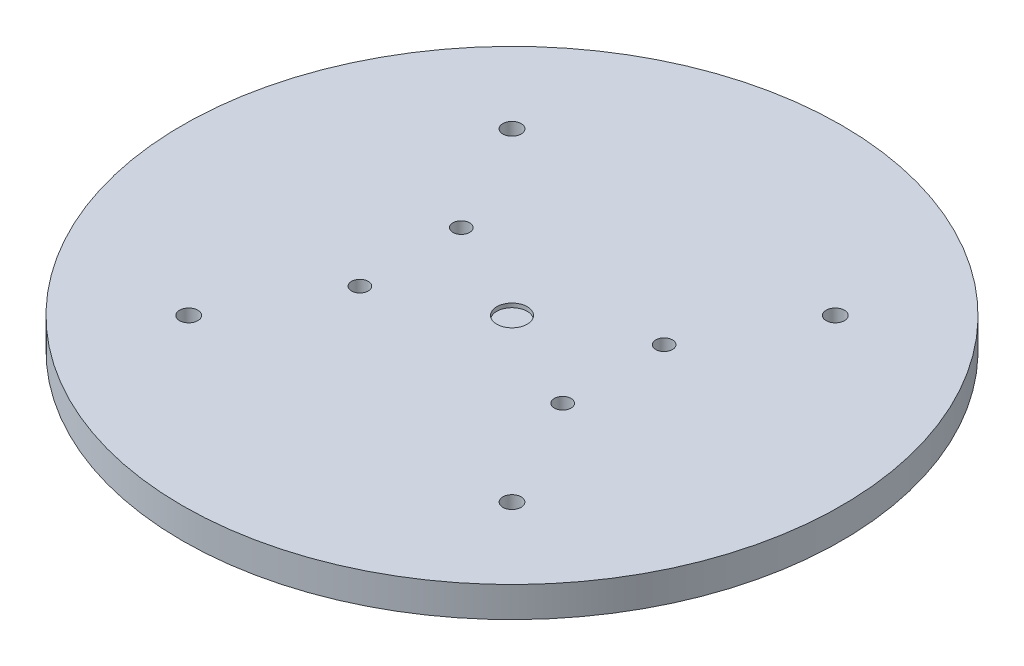
ISO-10303-21;
HEADER;
FILE_DESCRIPTION(('STEP AP214'),'2;1');
FILE_NAME('part.step','',(''),(''),'','','');
FILE_SCHEMA(('AUTOMOTIVE_DESIGN { 1 0 10303 214 1 1 1 1 }'));
ENDSEC;
DATA;
#1=APPLICATION_CONTEXT('core data for automotive mechanical design processes');
#2=APPLICATION_PROTOCOL_DEFINITION('international standard','automotive_design',2000,#1);
#3=PRODUCT_CONTEXT('',#1,'mechanical');
#4=PRODUCT('Part','Part','',(#3));
#5=PRODUCT_RELATED_PRODUCT_CATEGORY('part','',(#4));
#6=PRODUCT_DEFINITION_FORMATION('','',#4);
#7=PRODUCT_DEFINITION_CONTEXT('part definition',#1,'design');
#8=PRODUCT_DEFINITION('design','',#6,#7);
#9=PRODUCT_DEFINITION_SHAPE('','',#8);
#10=(LENGTH_UNIT() NAMED_UNIT(*) SI_UNIT(.MILLI.,.METRE.));
#11=(NAMED_UNIT(*) PLANE_ANGLE_UNIT() SI_UNIT($,.RADIAN.));
#12=(NAMED_UNIT(*) SI_UNIT($,.STERADIAN.) SOLID_ANGLE_UNIT());
#13=UNCERTAINTY_MEASURE_WITH_UNIT(LENGTH_MEASURE(1.E-05),#10,'distance_accuracy_value','');
#14=(GEOMETRIC_REPRESENTATION_CONTEXT(3) GLOBAL_UNCERTAINTY_ASSIGNED_CONTEXT((#13)) GLOBAL_UNIT_ASSIGNED_CONTEXT((#10,
#11,#12)) REPRESENTATION_CONTEXT('',''));
#15=CARTESIAN_POINT('',(0.,0.,0.));
#16=DIRECTION('',(0.,0.,1.));
#17=DIRECTION('',(1.,0.,0.));
#18=AXIS2_PLACEMENT_3D('',#15,#16,#17);
#19=CARTESIAN_POINT('',(0.,7.62,0.));
#20=DIRECTION('',(0.,1.,0.));
#21=DIRECTION('',(0.,0.,1.));
#22=AXIS2_PLACEMENT_3D('',#19,#20,#21);
#23=PLANE('',#22);
#24=CARTESIAN_POINT('',(-25.4,7.62,-12.7));
#25=DIRECTION('',(0.,1.,0.));
#26=DIRECTION('',(0.,0.,1.));
#27=AXIS2_PLACEMENT_3D('',#24,#25,#26);
#28=CIRCLE('',#27,2.1);
#29=CARTESIAN_POINT('',(-25.4,7.62,-10.6));
#30=VERTEX_POINT('',#29);
#31=EDGE_CURVE('E94',#30,#30,#28,.T.);
#32=ORIENTED_EDGE('',*,*,#31,.F.);
#33=EDGE_LOOP('',(#32));
#34=FACE_BOUND('',#33,.T.);
#35=CARTESIAN_POINT('',(25.4,7.62,-12.7));
#36=DIRECTION('',(0.,1.,0.));
#37=DIRECTION('',(0.,0.,1.));
#38=AXIS2_PLACEMENT_3D('',#35,#36,#37);
#39=CIRCLE('',#38,2.1);
#40=CARTESIAN_POINT('',(25.4,7.62,-10.6));
#41=VERTEX_POINT('',#40);
#42=EDGE_CURVE('E101',#41,#41,#39,.T.);
#43=ORIENTED_EDGE('',*,*,#42,.F.);
#44=EDGE_LOOP('',(#43));
#45=FACE_BOUND('',#44,.T.);
#46=CARTESIAN_POINT('',(25.4,7.62,12.7));
#47=DIRECTION('',(0.,1.,0.));
#48=DIRECTION('',(0.,0.,1.));
#49=AXIS2_PLACEMENT_3D('',#46,#47,#48);
#50=CIRCLE('',#49,2.1);
#51=CARTESIAN_POINT('',(25.4,7.62,14.8));
#52=VERTEX_POINT('',#51);
#53=EDGE_CURVE('E104',#52,#52,#50,.T.);
#54=ORIENTED_EDGE('',*,*,#53,.F.);
#55=EDGE_LOOP('',(#54));
#56=FACE_BOUND('',#55,.T.);
#57=CARTESIAN_POINT('',(-25.4,7.62,12.7));
#58=DIRECTION('',(0.,1.,0.));
#59=DIRECTION('',(0.,0.,1.));
#60=AXIS2_PLACEMENT_3D('',#57,#58,#59);
#61=CIRCLE('',#60,2.1);
#62=CARTESIAN_POINT('',(-25.4,7.62,14.8));
#63=VERTEX_POINT('',#62);
#64=EDGE_CURVE('E108',#63,#63,#61,.T.);
#65=ORIENTED_EDGE('',*,*,#64,.F.);
#66=EDGE_LOOP('',(#65));
#67=FACE_BOUND('',#66,.T.);
#68=CARTESIAN_POINT('',(0.,7.62,0.));
#69=DIRECTION('',(0.,1.,0.));
#70=DIRECTION('',(0.,0.,1.));
#71=AXIS2_PLACEMENT_3D('',#68,#69,#70);
#72=CIRCLE('',#71,3.81);
#73=CARTESIAN_POINT('',(0.,7.62,3.81));
#74=VERTEX_POINT('',#73);
#75=EDGE_CURVE('E89',#74,#74,#72,.T.);
#76=ORIENTED_EDGE('',*,*,#75,.F.);
#77=EDGE_LOOP('',(#76));
#78=FACE_BOUND('',#77,.T.);
#79=CARTESIAN_POINT('',(-40.49,7.62,40.49));
#80=DIRECTION('',(0.,1.,0.));
#81=DIRECTION('',(0.,0.,1.));
#82=AXIS2_PLACEMENT_3D('',#79,#80,#81);
#83=CIRCLE('',#82,2.28599999999999);
#84=CARTESIAN_POINT('',(-40.49,7.62,38.204));
#85=VERTEX_POINT('',#84);
#86=EDGE_CURVE('E67',#85,#85,#83,.T.);
#87=ORIENTED_EDGE('',*,*,#86,.F.);
#88=EDGE_LOOP('',(#87));
#89=FACE_BOUND('',#88,.T.);
#90=CARTESIAN_POINT('',(40.49,7.62,-40.49));
#91=DIRECTION('',(0.,1.,0.));
#92=DIRECTION('',(0.,0.,1.));
#93=AXIS2_PLACEMENT_3D('',#90,#91,#92);
#94=CIRCLE('',#93,2.286);
#95=CARTESIAN_POINT('',(40.49,7.62,-42.776));
#96=VERTEX_POINT('',#95);
#97=EDGE_CURVE('E57',#96,#96,#94,.T.);
#98=ORIENTED_EDGE('',*,*,#97,.F.);
#99=EDGE_LOOP('',(#98));
#100=FACE_BOUND('',#99,.T.);
#101=CARTESIAN_POINT('',(0.,7.62,0.));
#102=DIRECTION('',(0.,1.,0.));
#103=DIRECTION('',(0.,0.,1.));
#104=AXIS2_PLACEMENT_3D('',#101,#102,#103);
#105=CIRCLE('',#104,82.55);
#106=CARTESIAN_POINT('',(0.,7.62,-82.55));
#107=VERTEX_POINT('',#106);
#108=EDGE_CURVE('E10',#107,#107,#105,.T.);
#109=ORIENTED_EDGE('',*,*,#108,.T.);
#110=EDGE_LOOP('',(#109));
#111=FACE_BOUND('',#110,.T.);
#112=CARTESIAN_POINT('',(40.49,7.62,40.49));
#113=DIRECTION('',(0.,1.,0.));
#114=DIRECTION('',(0.,0.,1.));
#115=AXIS2_PLACEMENT_3D('',#112,#113,#114);
#116=CIRCLE('',#115,2.286);
#117=CARTESIAN_POINT('',(40.49,7.62,38.204));
#118=VERTEX_POINT('',#117);
#119=EDGE_CURVE('E65',#118,#118,#116,.T.);
#120=ORIENTED_EDGE('',*,*,#119,.F.);
#121=EDGE_LOOP('',(#120));
#122=FACE_BOUND('',#121,.T.);
#123=CARTESIAN_POINT('',(-40.49,7.62,-40.49));
#124=DIRECTION('',(0.,1.,0.));
#125=DIRECTION('',(0.,0.,1.));
#126=AXIS2_PLACEMENT_3D('',#123,#124,#125);
#127=CIRCLE('',#126,2.28599999999999);
#128=CARTESIAN_POINT('',(-40.49,7.62,-42.776));
#129=VERTEX_POINT('',#128);
#130=EDGE_CURVE('E76',#129,#129,#127,.T.);
#131=ORIENTED_EDGE('',*,*,#130,.F.);
#132=EDGE_LOOP('',(#131));
#133=FACE_BOUND('',#132,.T.);
#134=ADVANCED_FACE('F43',(#34,#45,#56,#67,#78,#89,#100,#111,#122,#133),#23,.T.);
#135=CARTESIAN_POINT('',(0.,0.,0.));
#136=DIRECTION('',(0.,1.,0.));
#137=DIRECTION('',(0.,0.,1.));
#138=AXIS2_PLACEMENT_3D('',#135,#136,#137);
#139=PLANE('',#138);
#140=CARTESIAN_POINT('',(-25.4,0.,-12.7));
#141=DIRECTION('',(0.,-1.,0.));
#142=DIRECTION('',(0.,0.,-1.));
#143=AXIS2_PLACEMENT_3D('',#140,#141,#142);
#144=CIRCLE('',#143,2.1);
#145=CARTESIAN_POINT('',(-25.4,0.,-14.8));
#146=VERTEX_POINT('',#145);
#147=EDGE_CURVE('E116',#146,#146,#144,.T.);
#148=ORIENTED_EDGE('',*,*,#147,.F.);
#149=EDGE_LOOP('',(#148));
#150=FACE_BOUND('',#149,.T.);
#151=CARTESIAN_POINT('',(25.4,0.,-12.7));
#152=DIRECTION('',(0.,-1.,0.));
#153=DIRECTION('',(0.,0.,-1.));
#154=AXIS2_PLACEMENT_3D('',#151,#152,#153);
#155=CIRCLE('',#154,2.1);
#156=CARTESIAN_POINT('',(25.4,0.,-14.8));
#157=VERTEX_POINT('',#156);
#158=EDGE_CURVE('E121',#157,#157,#155,.T.);
#159=ORIENTED_EDGE('',*,*,#158,.F.);
#160=EDGE_LOOP('',(#159));
#161=FACE_BOUND('',#160,.T.);
#162=CARTESIAN_POINT('',(25.4,0.,12.7));
#163=DIRECTION('',(0.,-1.,0.));
#164=DIRECTION('',(0.,0.,-1.));
#165=AXIS2_PLACEMENT_3D('',#162,#163,#164);
#166=CIRCLE('',#165,2.1);
#167=CARTESIAN_POINT('',(25.4,0.,10.6));
#168=VERTEX_POINT('',#167);
#169=EDGE_CURVE('E120',#168,#168,#166,.T.);
#170=ORIENTED_EDGE('',*,*,#169,.F.);
#171=EDGE_LOOP('',(#170));
#172=FACE_BOUND('',#171,.T.);
#173=CARTESIAN_POINT('',(-25.4,0.,12.7));
#174=DIRECTION('',(0.,-1.,0.));
#175=DIRECTION('',(0.,0.,-1.));
#176=AXIS2_PLACEMENT_3D('',#173,#174,#175);
#177=CIRCLE('',#176,2.1);
#178=CARTESIAN_POINT('',(-25.4,0.,10.6));
#179=VERTEX_POINT('',#178);
#180=EDGE_CURVE('E114',#179,#179,#177,.T.);
#181=ORIENTED_EDGE('',*,*,#180,.F.);
#182=EDGE_LOOP('',(#181));
#183=FACE_BOUND('',#182,.T.);
#184=CARTESIAN_POINT('',(0.,0.,0.));
#185=DIRECTION('',(0.,1.,0.));
#186=DIRECTION('',(0.,0.,1.));
#187=AXIS2_PLACEMENT_3D('',#184,#185,#186);
#188=CIRCLE('',#187,82.55);
#189=CARTESIAN_POINT('',(0.,0.,-82.55));
#190=VERTEX_POINT('',#189);
#191=EDGE_CURVE('E50',#190,#190,#188,.T.);
#192=ORIENTED_EDGE('',*,*,#191,.F.);
#193=EDGE_LOOP('',(#192));
#194=FACE_BOUND('',#193,.T.);
#195=CARTESIAN_POINT('',(40.49,0.,-40.49));
#196=DIRECTION('',(0.,1.,0.));
#197=DIRECTION('',(0.,0.,1.));
#198=AXIS2_PLACEMENT_3D('',#195,#196,#197);
#199=CIRCLE('',#198,2.286);
#200=CARTESIAN_POINT('',(40.49,0.,-42.776));
#201=VERTEX_POINT('',#200);
#202=EDGE_CURVE('E59',#201,#201,#199,.T.);
#203=ORIENTED_EDGE('',*,*,#202,.T.);
#204=EDGE_LOOP('',(#203));
#205=FACE_BOUND('',#204,.T.);
#206=CARTESIAN_POINT('',(40.49,0.,40.49));
#207=DIRECTION('',(0.,1.,0.));
#208=DIRECTION('',(0.,0.,1.));
#209=AXIS2_PLACEMENT_3D('',#206,#207,#208);
#210=CIRCLE('',#209,2.286);
#211=CARTESIAN_POINT('',(40.49,0.,38.204));
#212=VERTEX_POINT('',#211);
#213=EDGE_CURVE('E69',#212,#212,#210,.T.);
#214=ORIENTED_EDGE('',*,*,#213,.T.);
#215=EDGE_LOOP('',(#214));
#216=FACE_BOUND('',#215,.T.);
#217=CARTESIAN_POINT('',(-40.49,0.,40.49));
#218=DIRECTION('',(0.,1.,0.));
#219=DIRECTION('',(0.,0.,1.));
#220=AXIS2_PLACEMENT_3D('',#217,#218,#219);
#221=CIRCLE('',#220,2.28599999999999);
#222=CARTESIAN_POINT('',(-40.49,0.,38.204));
#223=VERTEX_POINT('',#222);
#224=EDGE_CURVE('E74',#223,#223,#221,.T.);
#225=ORIENTED_EDGE('',*,*,#224,.T.);
#226=EDGE_LOOP('',(#225));
#227=FACE_BOUND('',#226,.T.);
#228=CARTESIAN_POINT('',(-40.49,0.,-40.49));
#229=DIRECTION('',(0.,1.,0.));
#230=DIRECTION('',(0.,0.,1.));
#231=AXIS2_PLACEMENT_3D('',#228,#229,#230);
#232=CIRCLE('',#231,2.28599999999999);
#233=CARTESIAN_POINT('',(-40.49,0.,-42.776));
#234=VERTEX_POINT('',#233);
#235=EDGE_CURVE('E81',#234,#234,#232,.T.);
#236=ORIENTED_EDGE('',*,*,#235,.T.);
#237=EDGE_LOOP('',(#236));
#238=FACE_BOUND('',#237,.T.);
#239=ADVANCED_FACE('F135',(#150,#161,#172,#183,#194,#205,#216,#227,#238),#139,.F.);
#240=CARTESIAN_POINT('',(0.,7.62,0.));
#241=DIRECTION('',(0.,-1.,0.));
#242=DIRECTION('',(0.,0.,-1.));
#243=AXIS2_PLACEMENT_3D('',#240,#241,#242);
#244=CYLINDRICAL_SURFACE('',#243,82.55);
#245=CARTESIAN_POINT('',(0.,7.62,-82.55));
#246=CARTESIAN_POINT('',(0.,7.540625,-82.55));
#247=CARTESIAN_POINT('',(0.,7.46125,-82.55));
#248=CARTESIAN_POINT('',(0.,7.3025,-82.55));
#249=CARTESIAN_POINT('',(0.,7.223125,-82.55));
#250=CARTESIAN_POINT('',(0.,7.064375,-82.55));
#251=CARTESIAN_POINT('',(0.,6.985,-82.55));
#252=CARTESIAN_POINT('',(0.,6.82625,-82.55));
#253=CARTESIAN_POINT('',(0.,6.746875,-82.55));
#254=CARTESIAN_POINT('',(0.,6.588125,-82.55));
#255=CARTESIAN_POINT('',(0.,6.50875,-82.55));
#256=CARTESIAN_POINT('',(0.,6.35,-82.55));
#257=CARTESIAN_POINT('',(0.,6.270625,-82.55));
#258=CARTESIAN_POINT('',(0.,6.111875,-82.55));
#259=CARTESIAN_POINT('',(0.,6.0325,-82.55));
#260=CARTESIAN_POINT('',(0.,5.87375,-82.55));
#261=CARTESIAN_POINT('',(0.,5.794375,-82.55));
#262=CARTESIAN_POINT('',(0.,5.635625,-82.55));
#263=CARTESIAN_POINT('',(0.,5.55625,-82.55));
#264=CARTESIAN_POINT('',(0.,5.3975,-82.55));
#265=CARTESIAN_POINT('',(0.,5.318125,-82.55));
#266=CARTESIAN_POINT('',(0.,5.159375,-82.55));
#267=CARTESIAN_POINT('',(0.,5.08,-82.55));
#268=CARTESIAN_POINT('',(0.,4.92125,-82.55));
#269=CARTESIAN_POINT('',(0.,4.841875,-82.55));
#270=CARTESIAN_POINT('',(0.,4.683125,-82.55));
#271=CARTESIAN_POINT('',(0.,4.60375,-82.55));
#272=CARTESIAN_POINT('',(0.,4.445,-82.55));
#273=CARTESIAN_POINT('',(0.,4.365625,-82.55));
#274=CARTESIAN_POINT('',(0.,4.206875,-82.55));
#275=CARTESIAN_POINT('',(0.,4.1275,-82.55));
#276=CARTESIAN_POINT('',(0.,3.96875,-82.55));
#277=CARTESIAN_POINT('',(0.,3.889375,-82.55));
#278=CARTESIAN_POINT('',(0.,3.730625,-82.55));
#279=CARTESIAN_POINT('',(0.,3.65125,-82.55));
#280=CARTESIAN_POINT('',(0.,3.4925,-82.55));
#281=CARTESIAN_POINT('',(0.,3.413125,-82.55));
#282=CARTESIAN_POINT('',(0.,3.254375,-82.55));
#283=CARTESIAN_POINT('',(0.,3.175,-82.55));
#284=CARTESIAN_POINT('',(0.,3.01625,-82.55));
#285=CARTESIAN_POINT('',(0.,2.936875,-82.55));
#286=CARTESIAN_POINT('',(0.,2.778125,-82.55));
#287=CARTESIAN_POINT('',(0.,2.69875,-82.55));
#288=CARTESIAN_POINT('',(0.,2.54,-82.55));
#289=CARTESIAN_POINT('',(0.,2.460625,-82.55));
#290=CARTESIAN_POINT('',(0.,2.301875,-82.55));
#291=CARTESIAN_POINT('',(0.,2.2225,-82.55));
#292=CARTESIAN_POINT('',(0.,2.06375,-82.55));
#293=CARTESIAN_POINT('',(0.,1.984375,-82.55));
#294=CARTESIAN_POINT('',(0.,1.825625,-82.55));
#295=CARTESIAN_POINT('',(0.,1.74625,-82.55));
#296=CARTESIAN_POINT('',(0.,1.5875,-82.55));
#297=CARTESIAN_POINT('',(0.,1.508125,-82.55));
#298=CARTESIAN_POINT('',(0.,1.349375,-82.55));
#299=CARTESIAN_POINT('',(0.,1.27,-82.55));
#300=CARTESIAN_POINT('',(0.,1.11125,-82.55));
#301=CARTESIAN_POINT('',(0.,1.031875,-82.55));
#302=CARTESIAN_POINT('',(0.,0.873125,-82.55));
#303=CARTESIAN_POINT('',(0.,0.79375,-82.55));
#304=CARTESIAN_POINT('',(0.,0.635,-82.55));
#305=CARTESIAN_POINT('',(0.,0.555625,-82.55));
#306=CARTESIAN_POINT('',(0.,0.396875,-82.55));
#307=CARTESIAN_POINT('',(0.,0.3175,-82.55));
#308=CARTESIAN_POINT('',(0.,0.15875,-82.55));
#309=CARTESIAN_POINT('',(0.,0.0793749999999999,-82.55));
#310=CARTESIAN_POINT('',(0.,0.,-82.55));
#311=B_SPLINE_CURVE_WITH_KNOTS('',3,(#245,#246,#247,#248,#249,#250,#251,#252,#253,#254,#255,
#256,#257,#258,#259,#260,#261,#262,#263,#264,#265,#266,#267,#268,#269,#270,#271,#272,#273,#274,
#275,#276,#277,#278,#279,#280,#281,#282,#283,#284,#285,#286,#287,#288,#289,#290,#291,#292,#293,
#294,#295,#296,#297,#298,#299,#300,#301,#302,#303,#304,#305,#306,#307,#308,#309,#310),
.UNSPECIFIED.,.F.,.F.,(4,2,2,2,2,2,2,2,2,2,2,2,2,2,2,2,2,2,2,2,2,2,2,2,2,2,2,2,2,2,2,2,4),(0.,
0.238125,0.476249999999999,0.714375,0.952499999999999,1.190625,1.42875,1.666875,1.905,2.143125,
2.38125,2.619375,2.8575,3.095625,3.33375,3.571875,3.81,4.048125,4.28625,4.524375,4.7625,
5.000625,5.23875,5.476875,5.715,5.953125,6.19125,6.429375,6.6675,6.905625,7.14375,7.381875,
7.62),.UNSPECIFIED.);
#312=EDGE_CURVE('BSEAM44',#107,#190,#311,.T.);
#313=ORIENTED_EDGE('',*,*,#108,.F.);
#314=ORIENTED_EDGE('',*,*,#191,.T.);
#315=ORIENTED_EDGE('',*,*,#312,.T.);
#316=ORIENTED_EDGE('',*,*,#312,.F.);
#317=EDGE_LOOP('',(#313,#315,#314,#316));
#318=FACE_BOUND('',#317,.T.);
#319=ADVANCED_FACE('F44',(#318),#244,.T.);
#320=CARTESIAN_POINT('',(40.49,7.62,-40.49));
#321=DIRECTION('',(0.,-1.,0.));
#322=DIRECTION('',(0.,0.,-1.));
#323=AXIS2_PLACEMENT_3D('',#320,#321,#322);
#324=CYLINDRICAL_SURFACE('',#323,2.286);
#325=CARTESIAN_POINT('',(40.49,7.62,-42.776));
#326=CARTESIAN_POINT('',(40.49,7.540625,-42.776));
#327=CARTESIAN_POINT('',(40.49,7.46125,-42.776));
#328=CARTESIAN_POINT('',(40.49,7.3025,-42.776));
#329=CARTESIAN_POINT('',(40.49,7.223125,-42.776));
#330=CARTESIAN_POINT('',(40.49,7.064375,-42.776));
#331=CARTESIAN_POINT('',(40.49,6.985,-42.776));
#332=CARTESIAN_POINT('',(40.49,6.82625,-42.776));
#333=CARTESIAN_POINT('',(40.49,6.746875,-42.776));
#334=CARTESIAN_POINT('',(40.49,6.588125,-42.776));
#335=CARTESIAN_POINT('',(40.49,6.50875,-42.776));
#336=CARTESIAN_POINT('',(40.49,6.35,-42.776));
#337=CARTESIAN_POINT('',(40.49,6.270625,-42.776));
#338=CARTESIAN_POINT('',(40.49,6.111875,-42.776));
#339=CARTESIAN_POINT('',(40.49,6.0325,-42.776));
#340=CARTESIAN_POINT('',(40.49,5.87375,-42.776));
#341=CARTESIAN_POINT('',(40.49,5.794375,-42.776));
#342=CARTESIAN_POINT('',(40.49,5.635625,-42.776));
#343=CARTESIAN_POINT('',(40.49,5.55625,-42.776));
#344=CARTESIAN_POINT('',(40.49,5.3975,-42.776));
#345=CARTESIAN_POINT('',(40.49,5.318125,-42.776));
#346=CARTESIAN_POINT('',(40.49,5.159375,-42.776));
#347=CARTESIAN_POINT('',(40.49,5.08,-42.776));
#348=CARTESIAN_POINT('',(40.49,4.92125,-42.776));
#349=CARTESIAN_POINT('',(40.49,4.841875,-42.776));
#350=CARTESIAN_POINT('',(40.49,4.683125,-42.776));
#351=CARTESIAN_POINT('',(40.49,4.60375,-42.776));
#352=CARTESIAN_POINT('',(40.49,4.445,-42.776));
#353=CARTESIAN_POINT('',(40.49,4.365625,-42.776));
#354=CARTESIAN_POINT('',(40.49,4.206875,-42.776));
#355=CARTESIAN_POINT('',(40.49,4.1275,-42.776));
#356=CARTESIAN_POINT('',(40.49,3.96875,-42.776));
#357=CARTESIAN_POINT('',(40.49,3.889375,-42.776));
#358=CARTESIAN_POINT('',(40.49,3.730625,-42.776));
#359=CARTESIAN_POINT('',(40.49,3.65125,-42.776));
#360=CARTESIAN_POINT('',(40.49,3.4925,-42.776));
#361=CARTESIAN_POINT('',(40.49,3.413125,-42.776));
#362=CARTESIAN_POINT('',(40.49,3.254375,-42.776));
#363=CARTESIAN_POINT('',(40.49,3.175,-42.776));
#364=CARTESIAN_POINT('',(40.49,3.01625,-42.776));
#365=CARTESIAN_POINT('',(40.49,2.936875,-42.776));
#366=CARTESIAN_POINT('',(40.49,2.778125,-42.776));
#367=CARTESIAN_POINT('',(40.49,2.69875,-42.776));
#368=CARTESIAN_POINT('',(40.49,2.54,-42.776));
#369=CARTESIAN_POINT('',(40.49,2.460625,-42.776));
#370=CARTESIAN_POINT('',(40.49,2.301875,-42.776));
#371=CARTESIAN_POINT('',(40.49,2.2225,-42.776));
#372=CARTESIAN_POINT('',(40.49,2.06375,-42.776));
#373=CARTESIAN_POINT('',(40.49,1.984375,-42.776));
#374=CARTESIAN_POINT('',(40.49,1.825625,-42.776));
#375=CARTESIAN_POINT('',(40.49,1.74625,-42.776));
#376=CARTESIAN_POINT('',(40.49,1.5875,-42.776));
#377=CARTESIAN_POINT('',(40.49,1.508125,-42.776));
#378=CARTESIAN_POINT('',(40.49,1.349375,-42.776));
#379=CARTESIAN_POINT('',(40.49,1.27,-42.776));
#380=CARTESIAN_POINT('',(40.49,1.11125,-42.776));
#381=CARTESIAN_POINT('',(40.49,1.031875,-42.776));
#382=CARTESIAN_POINT('',(40.49,0.873125,-42.776));
#383=CARTESIAN_POINT('',(40.49,0.79375,-42.776));
#384=CARTESIAN_POINT('',(40.49,0.635,-42.776));
#385=CARTESIAN_POINT('',(40.49,0.555625,-42.776));
#386=CARTESIAN_POINT('',(40.49,0.396875,-42.776));
#387=CARTESIAN_POINT('',(40.49,0.3175,-42.776));
#388=CARTESIAN_POINT('',(40.49,0.15875,-42.776));
#389=CARTESIAN_POINT('',(40.49,0.0793749999999999,-42.776));
#390=CARTESIAN_POINT('',(40.49,0.,-42.776));
#391=B_SPLINE_CURVE_WITH_KNOTS('',3,(#325,#326,#327,#328,#329,#330,#331,#332,#333,#334,#335,
#336,#337,#338,#339,#340,#341,#342,#343,#344,#345,#346,#347,#348,#349,#350,#351,#352,#353,#354,
#355,#356,#357,#358,#359,#360,#361,#362,#363,#364,#365,#366,#367,#368,#369,#370,#371,#372,#373,
#374,#375,#376,#377,#378,#379,#380,#381,#382,#383,#384,#385,#386,#387,#388,#389,#390),
.UNSPECIFIED.,.F.,.F.,(4,2,2,2,2,2,2,2,2,2,2,2,2,2,2,2,2,2,2,2,2,2,2,2,2,2,2,2,2,2,2,2,4),(0.,
0.238125,0.47625,0.714375000000001,0.9525,1.190625,1.42875,1.666875,1.905,2.143125,2.38125,
2.619375,2.8575,3.095625,3.33375,3.571875,3.81,4.048125,4.28625,4.524375,4.7625,5.000625,
5.23875,5.476875,5.715,5.953125,6.19125,6.429375,6.6675,6.905625,7.14375,7.381875,7.62),.UNSPECIFIED.);
#392=EDGE_CURVE('BSEAM171',#96,#201,#391,.T.);
#393=ORIENTED_EDGE('',*,*,#97,.T.);
#394=ORIENTED_EDGE('',*,*,#202,.F.);
#395=ORIENTED_EDGE('',*,*,#392,.T.);
#396=ORIENTED_EDGE('',*,*,#392,.F.);
#397=EDGE_LOOP('',(#393,#395,#394,#396));
#398=FACE_BOUND('',#397,.T.);
#399=ADVANCED_FACE('F171',(#398),#324,.F.);
#400=CARTESIAN_POINT('',(40.49,7.62,40.49));
#401=DIRECTION('',(0.,-1.,0.));
#402=DIRECTION('',(0.,0.,-1.));
#403=AXIS2_PLACEMENT_3D('',#400,#401,#402);
#404=CYLINDRICAL_SURFACE('',#403,2.286);
#405=CARTESIAN_POINT('',(40.49,7.62,38.204));
#406=CARTESIAN_POINT('',(40.49,7.540625,38.204));
#407=CARTESIAN_POINT('',(40.49,7.46125,38.204));
#408=CARTESIAN_POINT('',(40.49,7.3025,38.204));
#409=CARTESIAN_POINT('',(40.49,7.223125,38.204));
#410=CARTESIAN_POINT('',(40.49,7.064375,38.204));
#411=CARTESIAN_POINT('',(40.49,6.985,38.204));
#412=CARTESIAN_POINT('',(40.49,6.82625,38.204));
#413=CARTESIAN_POINT('',(40.49,6.746875,38.204));
#414=CARTESIAN_POINT('',(40.49,6.588125,38.204));
#415=CARTESIAN_POINT('',(40.49,6.50875,38.204));
#416=CARTESIAN_POINT('',(40.49,6.35,38.204));
#417=CARTESIAN_POINT('',(40.49,6.270625,38.204));
#418=CARTESIAN_POINT('',(40.49,6.111875,38.204));
#419=CARTESIAN_POINT('',(40.49,6.0325,38.204));
#420=CARTESIAN_POINT('',(40.49,5.87375,38.204));
#421=CARTESIAN_POINT('',(40.49,5.794375,38.204));
#422=CARTESIAN_POINT('',(40.49,5.635625,38.204));
#423=CARTESIAN_POINT('',(40.49,5.55625,38.204));
#424=CARTESIAN_POINT('',(40.49,5.3975,38.204));
#425=CARTESIAN_POINT('',(40.49,5.318125,38.204));
#426=CARTESIAN_POINT('',(40.49,5.159375,38.204));
#427=CARTESIAN_POINT('',(40.49,5.08,38.204));
#428=CARTESIAN_POINT('',(40.49,4.92125,38.204));
#429=CARTESIAN_POINT('',(40.49,4.841875,38.204));
#430=CARTESIAN_POINT('',(40.49,4.683125,38.204));
#431=CARTESIAN_POINT('',(40.49,4.60375,38.204));
#432=CARTESIAN_POINT('',(40.49,4.445,38.204));
#433=CARTESIAN_POINT('',(40.49,4.365625,38.204));
#434=CARTESIAN_POINT('',(40.49,4.206875,38.204));
#435=CARTESIAN_POINT('',(40.49,4.1275,38.204));
#436=CARTESIAN_POINT('',(40.49,3.96875,38.204));
#437=CARTESIAN_POINT('',(40.49,3.889375,38.204));
#438=CARTESIAN_POINT('',(40.49,3.730625,38.204));
#439=CARTESIAN_POINT('',(40.49,3.65125,38.204));
#440=CARTESIAN_POINT('',(40.49,3.4925,38.204));
#441=CARTESIAN_POINT('',(40.49,3.413125,38.204));
#442=CARTESIAN_POINT('',(40.49,3.254375,38.204));
#443=CARTESIAN_POINT('',(40.49,3.175,38.204));
#444=CARTESIAN_POINT('',(40.49,3.01625,38.204));
#445=CARTESIAN_POINT('',(40.49,2.936875,38.204));
#446=CARTESIAN_POINT('',(40.49,2.778125,38.204));
#447=CARTESIAN_POINT('',(40.49,2.69875,38.204));
#448=CARTESIAN_POINT('',(40.49,2.54,38.204));
#449=CARTESIAN_POINT('',(40.49,2.460625,38.204));
#450=CARTESIAN_POINT('',(40.49,2.301875,38.204));
#451=CARTESIAN_POINT('',(40.49,2.2225,38.204));
#452=CARTESIAN_POINT('',(40.49,2.06375,38.204));
#453=CARTESIAN_POINT('',(40.49,1.984375,38.204));
#454=CARTESIAN_POINT('',(40.49,1.825625,38.204));
#455=CARTESIAN_POINT('',(40.49,1.74625,38.204));
#456=CARTESIAN_POINT('',(40.49,1.5875,38.204));
#457=CARTESIAN_POINT('',(40.49,1.508125,38.204));
#458=CARTESIAN_POINT('',(40.49,1.349375,38.204));
#459=CARTESIAN_POINT('',(40.49,1.27,38.204));
#460=CARTESIAN_POINT('',(40.49,1.11125,38.204));
#461=CARTESIAN_POINT('',(40.49,1.031875,38.204));
#462=CARTESIAN_POINT('',(40.49,0.873125,38.204));
#463=CARTESIAN_POINT('',(40.49,0.79375,38.204));
#464=CARTESIAN_POINT('',(40.49,0.635,38.204));
#465=CARTESIAN_POINT('',(40.49,0.555625,38.204));
#466=CARTESIAN_POINT('',(40.49,0.396875,38.204));
#467=CARTESIAN_POINT('',(40.49,0.3175,38.204));
#468=CARTESIAN_POINT('',(40.49,0.15875,38.204));
#469=CARTESIAN_POINT('',(40.49,0.0793749999999999,38.204));
#470=CARTESIAN_POINT('',(40.49,0.,38.204));
#471=B_SPLINE_CURVE_WITH_KNOTS('',3,(#405,#406,#407,#408,#409,#410,#411,#412,#413,#414,#415,
#416,#417,#418,#419,#420,#421,#422,#423,#424,#425,#426,#427,#428,#429,#430,#431,#432,#433,#434,
#435,#436,#437,#438,#439,#440,#441,#442,#443,#444,#445,#446,#447,#448,#449,#450,#451,#452,#453,
#454,#455,#456,#457,#458,#459,#460,#461,#462,#463,#464,#465,#466,#467,#468,#469,#470),
.UNSPECIFIED.,.F.,.F.,(4,2,2,2,2,2,2,2,2,2,2,2,2,2,2,2,2,2,2,2,2,2,2,2,2,2,2,2,2,2,2,2,4),(0.,
0.238125,0.47625,0.714375000000001,0.9525,1.190625,1.42875,1.666875,1.905,2.143125,2.38125,
2.619375,2.8575,3.095625,3.33375,3.571875,3.81,4.048125,4.28625,4.524375,4.7625,5.000625,
5.23875,5.476875,5.715,5.953125,6.19125,6.429375,6.6675,6.905625,7.14375,7.381875,7.62),.UNSPECIFIED.);
#472=EDGE_CURVE('BSEAM161',#118,#212,#471,.T.);
#473=ORIENTED_EDGE('',*,*,#119,.T.);
#474=ORIENTED_EDGE('',*,*,#213,.F.);
#475=ORIENTED_EDGE('',*,*,#472,.T.);
#476=ORIENTED_EDGE('',*,*,#472,.F.);
#477=EDGE_LOOP('',(#473,#475,#474,#476));
#478=FACE_BOUND('',#477,.T.);
#479=ADVANCED_FACE('F161',(#478),#404,.F.);
#480=CARTESIAN_POINT('',(-40.49,7.62,40.49));
#481=DIRECTION('',(0.,-1.,0.));
#482=DIRECTION('',(0.,0.,-1.));
#483=AXIS2_PLACEMENT_3D('',#480,#481,#482);
#484=CYLINDRICAL_SURFACE('',#483,2.28599999999999);
#485=CARTESIAN_POINT('',(-40.49,7.62,38.204));
#486=CARTESIAN_POINT('',(-40.49,7.540625,38.204));
#487=CARTESIAN_POINT('',(-40.49,7.46125,38.204));
#488=CARTESIAN_POINT('',(-40.49,7.3025,38.204));
#489=CARTESIAN_POINT('',(-40.49,7.223125,38.204));
#490=CARTESIAN_POINT('',(-40.49,7.064375,38.204));
#491=CARTESIAN_POINT('',(-40.49,6.985,38.204));
#492=CARTESIAN_POINT('',(-40.49,6.82625,38.204));
#493=CARTESIAN_POINT('',(-40.49,6.746875,38.204));
#494=CARTESIAN_POINT('',(-40.49,6.588125,38.204));
#495=CARTESIAN_POINT('',(-40.49,6.50875,38.204));
#496=CARTESIAN_POINT('',(-40.49,6.35,38.204));
#497=CARTESIAN_POINT('',(-40.49,6.270625,38.204));
#498=CARTESIAN_POINT('',(-40.49,6.111875,38.204));
#499=CARTESIAN_POINT('',(-40.49,6.0325,38.204));
#500=CARTESIAN_POINT('',(-40.49,5.87375,38.204));
#501=CARTESIAN_POINT('',(-40.49,5.794375,38.204));
#502=CARTESIAN_POINT('',(-40.49,5.635625,38.204));
#503=CARTESIAN_POINT('',(-40.49,5.55625,38.204));
#504=CARTESIAN_POINT('',(-40.49,5.3975,38.204));
#505=CARTESIAN_POINT('',(-40.49,5.318125,38.204));
#506=CARTESIAN_POINT('',(-40.49,5.159375,38.204));
#507=CARTESIAN_POINT('',(-40.49,5.08,38.204));
#508=CARTESIAN_POINT('',(-40.49,4.92125,38.204));
#509=CARTESIAN_POINT('',(-40.49,4.841875,38.204));
#510=CARTESIAN_POINT('',(-40.49,4.683125,38.204));
#511=CARTESIAN_POINT('',(-40.49,4.60375,38.204));
#512=CARTESIAN_POINT('',(-40.49,4.445,38.204));
#513=CARTESIAN_POINT('',(-40.49,4.365625,38.204));
#514=CARTESIAN_POINT('',(-40.49,4.206875,38.204));
#515=CARTESIAN_POINT('',(-40.49,4.1275,38.204));
#516=CARTESIAN_POINT('',(-40.49,3.96875,38.204));
#517=CARTESIAN_POINT('',(-40.49,3.889375,38.204));
#518=CARTESIAN_POINT('',(-40.49,3.730625,38.204));
#519=CARTESIAN_POINT('',(-40.49,3.65125,38.204));
#520=CARTESIAN_POINT('',(-40.49,3.4925,38.204));
#521=CARTESIAN_POINT('',(-40.49,3.413125,38.204));
#522=CARTESIAN_POINT('',(-40.49,3.254375,38.204));
#523=CARTESIAN_POINT('',(-40.49,3.175,38.204));
#524=CARTESIAN_POINT('',(-40.49,3.01625,38.204));
#525=CARTESIAN_POINT('',(-40.49,2.936875,38.204));
#526=CARTESIAN_POINT('',(-40.49,2.778125,38.204));
#527=CARTESIAN_POINT('',(-40.49,2.69875,38.204));
#528=CARTESIAN_POINT('',(-40.49,2.54,38.204));
#529=CARTESIAN_POINT('',(-40.49,2.460625,38.204));
#530=CARTESIAN_POINT('',(-40.49,2.301875,38.204));
#531=CARTESIAN_POINT('',(-40.49,2.2225,38.204));
#532=CARTESIAN_POINT('',(-40.49,2.06375,38.204));
#533=CARTESIAN_POINT('',(-40.49,1.984375,38.204));
#534=CARTESIAN_POINT('',(-40.49,1.825625,38.204));
#535=CARTESIAN_POINT('',(-40.49,1.74625,38.204));
#536=CARTESIAN_POINT('',(-40.49,1.5875,38.204));
#537=CARTESIAN_POINT('',(-40.49,1.508125,38.204));
#538=CARTESIAN_POINT('',(-40.49,1.349375,38.204));
#539=CARTESIAN_POINT('',(-40.49,1.27,38.204));
#540=CARTESIAN_POINT('',(-40.49,1.11125,38.204));
#541=CARTESIAN_POINT('',(-40.49,1.031875,38.204));
#542=CARTESIAN_POINT('',(-40.49,0.873125,38.204));
#543=CARTESIAN_POINT('',(-40.49,0.79375,38.204));
#544=CARTESIAN_POINT('',(-40.49,0.635,38.204));
#545=CARTESIAN_POINT('',(-40.49,0.555625,38.204));
#546=CARTESIAN_POINT('',(-40.49,0.396875,38.204));
#547=CARTESIAN_POINT('',(-40.49,0.3175,38.204));
#548=CARTESIAN_POINT('',(-40.49,0.15875,38.204));
#549=CARTESIAN_POINT('',(-40.49,0.0793749999999999,38.204));
#550=CARTESIAN_POINT('',(-40.49,0.,38.204));
#551=B_SPLINE_CURVE_WITH_KNOTS('',3,(#485,#486,#487,#488,#489,#490,#491,#492,#493,#494,#495,
#496,#497,#498,#499,#500,#501,#502,#503,#504,#505,#506,#507,#508,#509,#510,#511,#512,#513,#514,
#515,#516,#517,#518,#519,#520,#521,#522,#523,#524,#525,#526,#527,#528,#529,#530,#531,#532,#533,
#534,#535,#536,#537,#538,#539,#540,#541,#542,#543,#544,#545,#546,#547,#548,#549,#550),
.UNSPECIFIED.,.F.,.F.,(4,2,2,2,2,2,2,2,2,2,2,2,2,2,2,2,2,2,2,2,2,2,2,2,2,2,2,2,2,2,2,2,4),(0.,
0.238125,0.47625,0.714375000000001,0.9525,1.190625,1.42875,1.666875,1.905,2.143125,2.38125,
2.619375,2.8575,3.095625,3.33375,3.571875,3.81,4.048125,4.28625,4.524375,4.7625,5.000625,
5.23875,5.476875,5.715,5.953125,6.19125,6.429375,6.6675,6.905625,7.14375,7.381875,7.62),.UNSPECIFIED.);
#552=EDGE_CURVE('BSEAM151',#85,#223,#551,.T.);
#553=ORIENTED_EDGE('',*,*,#86,.T.);
#554=ORIENTED_EDGE('',*,*,#224,.F.);
#555=ORIENTED_EDGE('',*,*,#552,.T.);
#556=ORIENTED_EDGE('',*,*,#552,.F.);
#557=EDGE_LOOP('',(#553,#555,#554,#556));
#558=FACE_BOUND('',#557,.T.);
#559=ADVANCED_FACE('F151',(#558),#484,.F.);
#560=CARTESIAN_POINT('',(-40.49,7.62,-40.49));
#561=DIRECTION('',(0.,-1.,0.));
#562=DIRECTION('',(0.,0.,-1.));
#563=AXIS2_PLACEMENT_3D('',#560,#561,#562);
#564=CYLINDRICAL_SURFACE('',#563,2.28599999999999);
#565=CARTESIAN_POINT('',(-40.49,7.62,-42.776));
#566=CARTESIAN_POINT('',(-40.49,7.540625,-42.776));
#567=CARTESIAN_POINT('',(-40.49,7.46125,-42.776));
#568=CARTESIAN_POINT('',(-40.49,7.3025,-42.776));
#569=CARTESIAN_POINT('',(-40.49,7.223125,-42.776));
#570=CARTESIAN_POINT('',(-40.49,7.064375,-42.776));
#571=CARTESIAN_POINT('',(-40.49,6.985,-42.776));
#572=CARTESIAN_POINT('',(-40.49,6.82625,-42.776));
#573=CARTESIAN_POINT('',(-40.49,6.746875,-42.776));
#574=CARTESIAN_POINT('',(-40.49,6.588125,-42.776));
#575=CARTESIAN_POINT('',(-40.49,6.50875,-42.776));
#576=CARTESIAN_POINT('',(-40.49,6.35,-42.776));
#577=CARTESIAN_POINT('',(-40.49,6.270625,-42.776));
#578=CARTESIAN_POINT('',(-40.49,6.111875,-42.776));
#579=CARTESIAN_POINT('',(-40.49,6.0325,-42.776));
#580=CARTESIAN_POINT('',(-40.49,5.87375,-42.776));
#581=CARTESIAN_POINT('',(-40.49,5.794375,-42.776));
#582=CARTESIAN_POINT('',(-40.49,5.635625,-42.776));
#583=CARTESIAN_POINT('',(-40.49,5.55625,-42.776));
#584=CARTESIAN_POINT('',(-40.49,5.3975,-42.776));
#585=CARTESIAN_POINT('',(-40.49,5.318125,-42.776));
#586=CARTESIAN_POINT('',(-40.49,5.159375,-42.776));
#587=CARTESIAN_POINT('',(-40.49,5.08,-42.776));
#588=CARTESIAN_POINT('',(-40.49,4.92125,-42.776));
#589=CARTESIAN_POINT('',(-40.49,4.841875,-42.776));
#590=CARTESIAN_POINT('',(-40.49,4.683125,-42.776));
#591=CARTESIAN_POINT('',(-40.49,4.60375,-42.776));
#592=CARTESIAN_POINT('',(-40.49,4.445,-42.776));
#593=CARTESIAN_POINT('',(-40.49,4.365625,-42.776));
#594=CARTESIAN_POINT('',(-40.49,4.206875,-42.776));
#595=CARTESIAN_POINT('',(-40.49,4.1275,-42.776));
#596=CARTESIAN_POINT('',(-40.49,3.96875,-42.776));
#597=CARTESIAN_POINT('',(-40.49,3.889375,-42.776));
#598=CARTESIAN_POINT('',(-40.49,3.730625,-42.776));
#599=CARTESIAN_POINT('',(-40.49,3.65125,-42.776));
#600=CARTESIAN_POINT('',(-40.49,3.4925,-42.776));
#601=CARTESIAN_POINT('',(-40.49,3.413125,-42.776));
#602=CARTESIAN_POINT('',(-40.49,3.254375,-42.776));
#603=CARTESIAN_POINT('',(-40.49,3.175,-42.776));
#604=CARTESIAN_POINT('',(-40.49,3.01625,-42.776));
#605=CARTESIAN_POINT('',(-40.49,2.936875,-42.776));
#606=CARTESIAN_POINT('',(-40.49,2.778125,-42.776));
#607=CARTESIAN_POINT('',(-40.49,2.69875,-42.776));
#608=CARTESIAN_POINT('',(-40.49,2.54,-42.776));
#609=CARTESIAN_POINT('',(-40.49,2.460625,-42.776));
#610=CARTESIAN_POINT('',(-40.49,2.301875,-42.776));
#611=CARTESIAN_POINT('',(-40.49,2.2225,-42.776));
#612=CARTESIAN_POINT('',(-40.49,2.06375,-42.776));
#613=CARTESIAN_POINT('',(-40.49,1.984375,-42.776));
#614=CARTESIAN_POINT('',(-40.49,1.825625,-42.776));
#615=CARTESIAN_POINT('',(-40.49,1.74625,-42.776));
#616=CARTESIAN_POINT('',(-40.49,1.5875,-42.776));
#617=CARTESIAN_POINT('',(-40.49,1.508125,-42.776));
#618=CARTESIAN_POINT('',(-40.49,1.349375,-42.776));
#619=CARTESIAN_POINT('',(-40.49,1.27,-42.776));
#620=CARTESIAN_POINT('',(-40.49,1.11125,-42.776));
#621=CARTESIAN_POINT('',(-40.49,1.031875,-42.776));
#622=CARTESIAN_POINT('',(-40.49,0.873125,-42.776));
#623=CARTESIAN_POINT('',(-40.49,0.79375,-42.776));
#624=CARTESIAN_POINT('',(-40.49,0.635,-42.776));
#625=CARTESIAN_POINT('',(-40.49,0.555625,-42.776));
#626=CARTESIAN_POINT('',(-40.49,0.396875,-42.776));
#627=CARTESIAN_POINT('',(-40.49,0.3175,-42.776));
#628=CARTESIAN_POINT('',(-40.49,0.15875,-42.776));
#629=CARTESIAN_POINT('',(-40.49,0.0793749999999999,-42.776));
#630=CARTESIAN_POINT('',(-40.49,0.,-42.776));
#631=B_SPLINE_CURVE_WITH_KNOTS('',3,(#565,#566,#567,#568,#569,#570,#571,#572,#573,#574,#575,
#576,#577,#578,#579,#580,#581,#582,#583,#584,#585,#586,#587,#588,#589,#590,#591,#592,#593,#594,
#595,#596,#597,#598,#599,#600,#601,#602,#603,#604,#605,#606,#607,#608,#609,#610,#611,#612,#613,
#614,#615,#616,#617,#618,#619,#620,#621,#622,#623,#624,#625,#626,#627,#628,#629,#630),
.UNSPECIFIED.,.F.,.F.,(4,2,2,2,2,2,2,2,2,2,2,2,2,2,2,2,2,2,2,2,2,2,2,2,2,2,2,2,2,2,2,2,4),(0.,
0.238125,0.47625,0.714375000000001,0.9525,1.190625,1.42875,1.666875,1.905,2.143125,2.38125,
2.619375,2.8575,3.095625,3.33375,3.571875,3.81,4.048125,4.28625,4.524375,4.7625,5.000625,
5.23875,5.476875,5.715,5.953125,6.19125,6.429375,6.6675,6.905625,7.14375,7.381875,7.62),.UNSPECIFIED.);
#632=EDGE_CURVE('BSEAM146',#129,#234,#631,.T.);
#633=ORIENTED_EDGE('',*,*,#130,.T.);
#634=ORIENTED_EDGE('',*,*,#235,.F.);
#635=ORIENTED_EDGE('',*,*,#632,.T.);
#636=ORIENTED_EDGE('',*,*,#632,.F.);
#637=EDGE_LOOP('',(#633,#635,#634,#636));
#638=FACE_BOUND('',#637,.T.);
#639=ADVANCED_FACE('F146',(#638),#564,.F.);
#640=CARTESIAN_POINT('',(0.,6.604,0.));
#641=DIRECTION('',(0.,1.,0.));
#642=DIRECTION('',(0.,0.,1.));
#643=AXIS2_PLACEMENT_3D('',#640,#641,#642);
#644=CYLINDRICAL_SURFACE('',#643,3.81);
#645=CARTESIAN_POINT('',(0.,6.604,0.));
#646=DIRECTION('',(0.,1.,0.));
#647=DIRECTION('',(0.,0.,1.));
#648=AXIS2_PLACEMENT_3D('',#645,#646,#647);
#649=CIRCLE('',#648,3.81);
#650=CARTESIAN_POINT('',(0.,6.604,3.81));
#651=VERTEX_POINT('',#650);
#652=EDGE_CURVE('E88',#651,#651,#649,.T.);
#653=ORIENTED_EDGE('',*,*,#652,.F.);
#654=EDGE_LOOP('',(#653));
#655=FACE_BOUND('',#654,.T.);
#656=ORIENTED_EDGE('',*,*,#75,.T.);
#657=EDGE_LOOP('',(#656));
#658=FACE_BOUND('',#657,.T.);
#659=ADVANCED_FACE('F147',(#655,#658),#644,.F.);
#660=CARTESIAN_POINT('',(0.,6.604,0.));
#661=DIRECTION('',(0.,1.,0.));
#662=DIRECTION('',(0.,0.,1.));
#663=AXIS2_PLACEMENT_3D('',#660,#661,#662);
#664=PLANE('',#663);
#665=ORIENTED_EDGE('',*,*,#652,.T.);
#666=EDGE_LOOP('',(#665));
#667=FACE_BOUND('',#666,.T.);
#668=ADVANCED_FACE('F158',(#667),#664,.T.);
#669=CARTESIAN_POINT('',(-25.4,54.356,12.7));
#670=DIRECTION('',(0.,-1.,0.));
#671=DIRECTION('',(0.,0.,-1.));
#672=AXIS2_PLACEMENT_3D('',#669,#670,#671);
#673=CYLINDRICAL_SURFACE('',#672,2.1);
#674=ORIENTED_EDGE('',*,*,#64,.T.);
#675=EDGE_LOOP('',(#674));
#676=FACE_BOUND('',#675,.T.);
#677=ORIENTED_EDGE('',*,*,#180,.T.);
#678=EDGE_LOOP('',(#677));
#679=FACE_BOUND('',#678,.T.);
#680=ADVANCED_FACE('F213',(#676,#679),#673,.F.);
#681=CARTESIAN_POINT('',(25.4,54.356,12.7));
#682=DIRECTION('',(0.,-1.,0.));
#683=DIRECTION('',(0.,0.,-1.));
#684=AXIS2_PLACEMENT_3D('',#681,#682,#683);
#685=CYLINDRICAL_SURFACE('',#684,2.1);
#686=ORIENTED_EDGE('',*,*,#53,.T.);
#687=EDGE_LOOP('',(#686));
#688=FACE_BOUND('',#687,.T.);
#689=ORIENTED_EDGE('',*,*,#169,.T.);
#690=EDGE_LOOP('',(#689));
#691=FACE_BOUND('',#690,.T.);
#692=ADVANCED_FACE('F128',(#688,#691),#685,.F.);
#693=CARTESIAN_POINT('',(25.4,54.356,-12.7));
#694=DIRECTION('',(0.,-1.,0.));
#695=DIRECTION('',(0.,0.,-1.));
#696=AXIS2_PLACEMENT_3D('',#693,#694,#695);
#697=CYLINDRICAL_SURFACE('',#696,2.1);
#698=ORIENTED_EDGE('',*,*,#42,.T.);
#699=EDGE_LOOP('',(#698));
#700=FACE_BOUND('',#699,.T.);
#701=ORIENTED_EDGE('',*,*,#158,.T.);
#702=EDGE_LOOP('',(#701));
#703=FACE_BOUND('',#702,.T.);
#704=ADVANCED_FACE('F231',(#700,#703),#697,.F.);
#705=CARTESIAN_POINT('',(-25.4,54.356,-12.7));
#706=DIRECTION('',(0.,-1.,0.));
#707=DIRECTION('',(0.,0.,-1.));
#708=AXIS2_PLACEMENT_3D('',#705,#706,#707);
#709=CYLINDRICAL_SURFACE('',#708,2.1);
#710=ORIENTED_EDGE('',*,*,#31,.T.);
#711=EDGE_LOOP('',(#710));
#712=FACE_BOUND('',#711,.T.);
#713=ORIENTED_EDGE('',*,*,#147,.T.);
#714=EDGE_LOOP('',(#713));
#715=FACE_BOUND('',#714,.T.);
#716=ADVANCED_FACE('F245',(#712,#715),#709,.F.);
#717=CLOSED_SHELL('',(#134,#239,#319,#399,#479,#559,#639,#659,#668,#680,#692,#704,#716));
#718=MANIFOLD_SOLID_BREP('B2',#717);
#719=ADVANCED_BREP_SHAPE_REPRESENTATION('',(#18,#718),#14);
#720=SHAPE_DEFINITION_REPRESENTATION(#9,#719);
ENDSEC;
END-ISO-10303-21;
